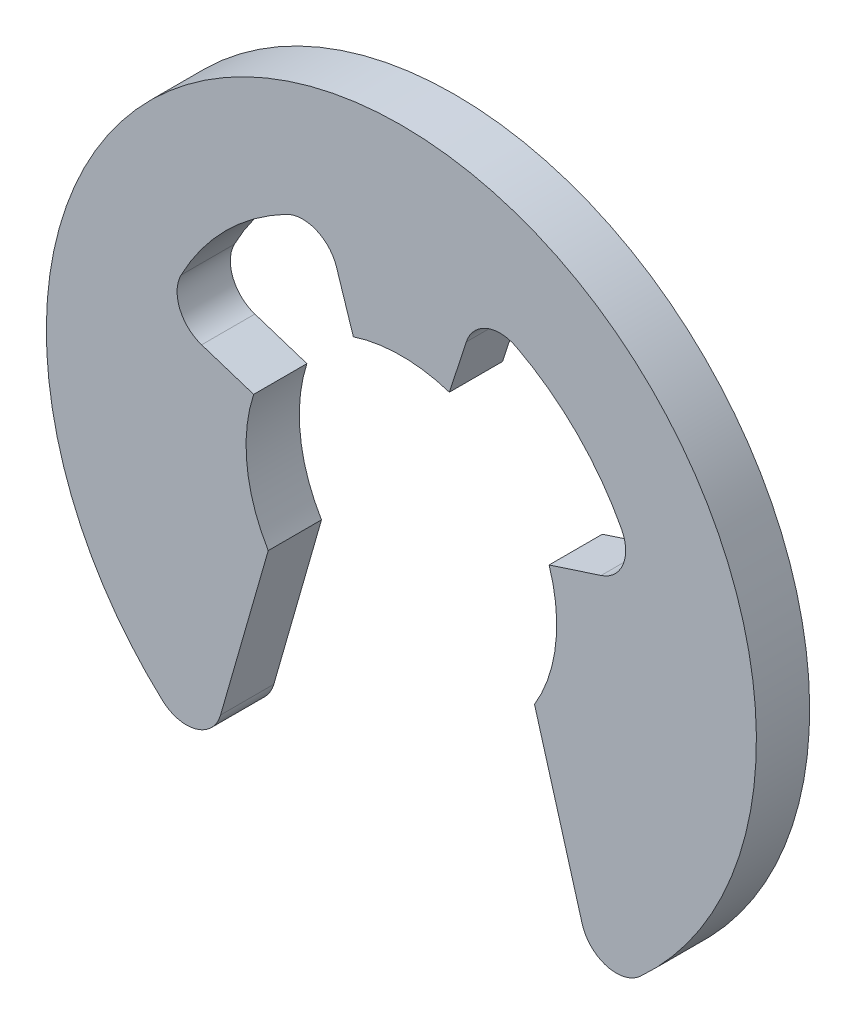
ISO-10303-21;
HEADER;
FILE_DESCRIPTION(('STEP AP214'),'2;1');
FILE_NAME('part.step','',(''),(''),'','','');
FILE_SCHEMA(('AUTOMOTIVE_DESIGN { 1 0 10303 214 1 1 1 1 }'));
ENDSEC;
DATA;
#1=APPLICATION_CONTEXT('core data for automotive mechanical design processes');
#2=APPLICATION_PROTOCOL_DEFINITION('international standard','automotive_design',2000,#1);
#3=PRODUCT_CONTEXT('',#1,'mechanical');
#4=PRODUCT('Part','Part','',(#3));
#5=PRODUCT_RELATED_PRODUCT_CATEGORY('part','',(#4));
#6=PRODUCT_DEFINITION_FORMATION('','',#4);
#7=PRODUCT_DEFINITION_CONTEXT('part definition',#1,'design');
#8=PRODUCT_DEFINITION('design','',#6,#7);
#9=PRODUCT_DEFINITION_SHAPE('','',#8);
#10=(LENGTH_UNIT() NAMED_UNIT(*) SI_UNIT(.MILLI.,.METRE.));
#11=(NAMED_UNIT(*) PLANE_ANGLE_UNIT() SI_UNIT($,.RADIAN.));
#12=(NAMED_UNIT(*) SI_UNIT($,.STERADIAN.) SOLID_ANGLE_UNIT());
#13=UNCERTAINTY_MEASURE_WITH_UNIT(LENGTH_MEASURE(1.E-05),#10,'distance_accuracy_value','');
#14=(GEOMETRIC_REPRESENTATION_CONTEXT(3) GLOBAL_UNCERTAINTY_ASSIGNED_CONTEXT((#13)) GLOBAL_UNIT_ASSIGNED_CONTEXT((#10,
#11,#12)) REPRESENTATION_CONTEXT('',''));
#15=CARTESIAN_POINT('',(0.,0.,0.));
#16=DIRECTION('',(0.,0.,1.));
#17=DIRECTION('',(1.,0.,0.));
#18=AXIS2_PLACEMENT_3D('',#15,#16,#17);
#19=CARTESIAN_POINT('',(2.12700369370558,1.1116902837404,-0.6));
#20=DIRECTION('',(0.,0.,1.));
#21=DIRECTION('',(1.,0.,0.));
#22=AXIS2_PLACEMENT_3D('',#19,#20,#21);
#23=CYLINDRICAL_SURFACE('',#22,0.4);
#24=CARTESIAN_POINT('',(2.12700369370558,1.1116902837404,0.));
#25=DIRECTION('',(0.,0.,-1.));
#26=DIRECTION('',(-1.,0.,0.));
#27=AXIS2_PLACEMENT_3D('',#24,#25,#26);
#28=CIRCLE('',#27,0.4);
#29=CARTESIAN_POINT('',(2.48150430932318,1.29697199769713,0.));
#30=VERTEX_POINT('',#29);
#31=CARTESIAN_POINT('',(2.25061049145556,0.731267677222336,0.));
#32=VERTEX_POINT('',#31);
#33=EDGE_CURVE('E188',#30,#32,#28,.T.);
#34=ORIENTED_EDGE('',*,*,#33,.F.);
#35=DIRECTION('',(0.,0.,1.));
#36=VECTOR('',#35,1.);
#37=CARTESIAN_POINT('',(2.48150430932318,1.29697199769713,-0.6));
#38=LINE('',#37,#36);
#39=CARTESIAN_POINT('',(2.48150430932318,1.29697199769713,-0.6));
#40=VERTEX_POINT('',#39);
#41=EDGE_CURVE('E11',#40,#30,#38,.T.);
#42=ORIENTED_EDGE('',*,*,#41,.F.);
#43=CARTESIAN_POINT('',(2.12700369370558,1.1116902837404,-0.6));
#44=DIRECTION('',(0.,0.,-1.));
#45=DIRECTION('',(-1.,0.,0.));
#46=AXIS2_PLACEMENT_3D('',#43,#44,#45);
#47=CIRCLE('',#46,0.4);
#48=CARTESIAN_POINT('',(2.25061049145556,0.731267677222336,-0.6));
#49=VERTEX_POINT('',#48);
#50=EDGE_CURVE('E238',#40,#49,#47,.T.);
#51=ORIENTED_EDGE('',*,*,#50,.T.);
#52=DIRECTION('',(0.,0.,1.));
#53=VECTOR('',#52,1.);
#54=CARTESIAN_POINT('',(2.25061049145556,0.731267677222336,-0.6));
#55=LINE('',#54,#53);
#56=EDGE_CURVE('E34',#49,#32,#55,.T.);
#57=ORIENTED_EDGE('',*,*,#56,.T.);
#58=EDGE_LOOP('',(#34,#42,#51,#57));
#59=FACE_BOUND('',#58,.T.);
#60=ADVANCED_FACE('F31',(#59),#23,.F.);
#61=CARTESIAN_POINT('',(0.,0.,-0.6));
#62=DIRECTION('',(0.,0.,1.));
#63=DIRECTION('',(1.,0.,0.));
#64=AXIS2_PLACEMENT_3D('',#61,#62,#63);
#65=CYLINDRICAL_SURFACE('',#64,2.8);
#66=CARTESIAN_POINT('',(0.,0.,0.));
#67=DIRECTION('',(0.,0.,-1.));
#68=DIRECTION('',(1.,0.,0.));
#69=AXIS2_PLACEMENT_3D('',#66,#67,#68);
#70=CIRCLE('',#69,2.8);
#71=CARTESIAN_POINT('',(1.29697199769711,2.48150430932319,0.));
#72=VERTEX_POINT('',#71);
#73=EDGE_CURVE('E236',#72,#30,#70,.T.);
#74=ORIENTED_EDGE('',*,*,#73,.F.);
#75=DIRECTION('',(0.,0.,1.));
#76=VECTOR('',#75,1.);
#77=CARTESIAN_POINT('',(1.29697199769711,2.48150430932319,-0.6));
#78=LINE('',#77,#76);
#79=CARTESIAN_POINT('',(1.29697199769711,2.48150430932319,-0.6));
#80=VERTEX_POINT('',#79);
#81=EDGE_CURVE('E40',#80,#72,#78,.T.);
#82=ORIENTED_EDGE('',*,*,#81,.F.);
#83=CARTESIAN_POINT('',(0.,0.,-0.6));
#84=DIRECTION('',(0.,0.,-1.));
#85=DIRECTION('',(1.,0.,0.));
#86=AXIS2_PLACEMENT_3D('',#83,#84,#85);
#87=CIRCLE('',#86,2.8);
#88=EDGE_CURVE('E178',#80,#40,#87,.T.);
#89=ORIENTED_EDGE('',*,*,#88,.T.);
#90=ORIENTED_EDGE('',*,*,#41,.T.);
#91=EDGE_LOOP('',(#74,#82,#89,#90));
#92=FACE_BOUND('',#91,.T.);
#93=ADVANCED_FACE('F270',(#92),#65,.F.);
#94=CARTESIAN_POINT('',(1.11169028374038,2.12700369370559,-0.6));
#95=DIRECTION('',(0.,0.,1.));
#96=DIRECTION('',(1.,0.,0.));
#97=AXIS2_PLACEMENT_3D('',#94,#95,#96);
#98=CYLINDRICAL_SURFACE('',#97,0.4);
#99=CARTESIAN_POINT('',(1.11169028374038,2.12700369370559,0.));
#100=DIRECTION('',(0.,0.,-1.));
#101=DIRECTION('',(-1.,0.,0.));
#102=AXIS2_PLACEMENT_3D('',#99,#100,#101);
#103=CIRCLE('',#102,0.4);
#104=CARTESIAN_POINT('',(0.731267677222318,2.25061049145557,0.));
#105=VERTEX_POINT('',#104);
#106=EDGE_CURVE('E165',#105,#72,#103,.T.);
#107=ORIENTED_EDGE('',*,*,#106,.F.);
#108=DIRECTION('',(0.,0.,1.));
#109=VECTOR('',#108,1.);
#110=CARTESIAN_POINT('',(0.731267677222318,2.25061049145557,-0.6));
#111=LINE('',#110,#109);
#112=CARTESIAN_POINT('',(0.731267677222318,2.25061049145557,-0.6));
#113=VERTEX_POINT('',#112);
#114=EDGE_CURVE('E160',#113,#105,#111,.T.);
#115=ORIENTED_EDGE('',*,*,#114,.F.);
#116=CARTESIAN_POINT('',(1.11169028374038,2.12700369370559,-0.6));
#117=DIRECTION('',(0.,0.,-1.));
#118=DIRECTION('',(-1.,0.,0.));
#119=AXIS2_PLACEMENT_3D('',#116,#117,#118);
#120=CIRCLE('',#119,0.4);
#121=EDGE_CURVE('E163',#113,#80,#120,.T.);
#122=ORIENTED_EDGE('',*,*,#121,.T.);
#123=ORIENTED_EDGE('',*,*,#81,.T.);
#124=EDGE_LOOP('',(#107,#115,#122,#123));
#125=FACE_BOUND('',#124,.T.);
#126=ADVANCED_FACE('F162',(#125),#98,.F.);
#127=CARTESIAN_POINT('',(0.731267677222318,2.25061049145557,-0.6));
#128=DIRECTION('',(0.951056516295156,-0.30901699437494,0.));
#129=DIRECTION('',(0.30901699437494,0.951056516295156,0.));
#130=AXIS2_PLACEMENT_3D('',#127,#128,#129);
#131=PLANE('',#130);
#132=DIRECTION('',(0.30901699437494,0.951056516295156,0.));
#133=VECTOR('',#132,1.);
#134=CARTESIAN_POINT('',(0.731267677222318,2.25061049145557,0.));
#135=LINE('',#134,#133);
#136=CARTESIAN_POINT('',(0.540779740156147,1.66434890351652,0.));
#137=VERTEX_POINT('',#136);
#138=EDGE_CURVE('E233',#137,#105,#135,.T.);
#139=ORIENTED_EDGE('',*,*,#138,.F.);
#140=DIRECTION('',(0.,0.,1.));
#141=VECTOR('',#140,1.);
#142=CARTESIAN_POINT('',(0.540779740156147,1.66434890351652,-0.6));
#143=LINE('',#142,#141);
#144=CARTESIAN_POINT('',(0.540779740156147,1.66434890351652,-0.6));
#145=VERTEX_POINT('',#144);
#146=EDGE_CURVE('E170',#145,#137,#143,.T.);
#147=ORIENTED_EDGE('',*,*,#146,.F.);
#148=DIRECTION('',(0.30901699437494,0.951056516295156,0.));
#149=VECTOR('',#148,1.);
#150=CARTESIAN_POINT('',(0.731267677222318,2.25061049145557,-0.6));
#151=LINE('',#150,#149);
#152=EDGE_CURVE('E176',#145,#113,#151,.T.);
#153=ORIENTED_EDGE('',*,*,#152,.T.);
#154=ORIENTED_EDGE('',*,*,#114,.T.);
#155=EDGE_LOOP('',(#139,#147,#153,#154));
#156=FACE_BOUND('',#155,.T.);
#157=ADVANCED_FACE('F180',(#156),#131,.T.);
#158=CARTESIAN_POINT('',(0.,0.,-0.6));
#159=DIRECTION('',(0.,0.,1.));
#160=DIRECTION('',(1.,0.,0.));
#161=AXIS2_PLACEMENT_3D('',#158,#159,#160);
#162=CYLINDRICAL_SURFACE('',#161,1.75);
#163=CARTESIAN_POINT('',(0.,0.,0.));
#164=DIRECTION('',(0.,0.,-1.));
#165=DIRECTION('',(1.,0.,0.));
#166=AXIS2_PLACEMENT_3D('',#163,#164,#165);
#167=CIRCLE('',#166,1.75);
#168=CARTESIAN_POINT('',(-0.540779740156147,1.66434890351652,0.));
#169=VERTEX_POINT('',#168);
#170=EDGE_CURVE('E230',#169,#137,#167,.T.);
#171=ORIENTED_EDGE('',*,*,#170,.F.);
#172=DIRECTION('',(0.,0.,1.));
#173=VECTOR('',#172,1.);
#174=CARTESIAN_POINT('',(-0.540779740156147,1.66434890351652,-0.6));
#175=LINE('',#174,#173);
#176=CARTESIAN_POINT('',(-0.540779740156147,1.66434890351652,-0.6));
#177=VERTEX_POINT('',#176);
#178=EDGE_CURVE('E242',#177,#169,#175,.T.);
#179=ORIENTED_EDGE('',*,*,#178,.F.);
#180=CARTESIAN_POINT('',(0.,0.,-0.6));
#181=DIRECTION('',(0.,0.,-1.));
#182=DIRECTION('',(1.,0.,0.));
#183=AXIS2_PLACEMENT_3D('',#180,#181,#182);
#184=CIRCLE('',#183,1.75);
#185=EDGE_CURVE('E181',#177,#145,#184,.T.);
#186=ORIENTED_EDGE('',*,*,#185,.T.);
#187=ORIENTED_EDGE('',*,*,#146,.T.);
#188=EDGE_LOOP('',(#171,#179,#186,#187));
#189=FACE_BOUND('',#188,.T.);
#190=ADVANCED_FACE('F283',(#189),#162,.F.);
#191=CARTESIAN_POINT('',(-0.731267677222318,2.25061049145557,-0.6));
#192=DIRECTION('',(-0.951056516295156,-0.309016994374941,0.));
#193=DIRECTION('',(0.309016994374941,-0.951056516295156,0.));
#194=AXIS2_PLACEMENT_3D('',#191,#192,#193);
#195=PLANE('',#194);
#196=DIRECTION('',(0.309016994374941,-0.951056516295156,0.));
#197=VECTOR('',#196,1.);
#198=CARTESIAN_POINT('',(-0.731267677222318,2.25061049145557,0.));
#199=LINE('',#198,#197);
#200=CARTESIAN_POINT('',(-0.731267677222318,2.25061049145557,0.));
#201=VERTEX_POINT('',#200);
#202=EDGE_CURVE('E227',#201,#169,#199,.T.);
#203=ORIENTED_EDGE('',*,*,#202,.F.);
#204=DIRECTION('',(0.,0.,1.));
#205=VECTOR('',#204,1.);
#206=CARTESIAN_POINT('',(-0.731267677222318,2.25061049145557,-0.6));
#207=LINE('',#206,#205);
#208=CARTESIAN_POINT('',(-0.731267677222318,2.25061049145557,-0.6));
#209=VERTEX_POINT('',#208);
#210=EDGE_CURVE('E244',#209,#201,#207,.T.);
#211=ORIENTED_EDGE('',*,*,#210,.F.);
#212=DIRECTION('',(0.309016994374941,-0.951056516295156,0.));
#213=VECTOR('',#212,1.);
#214=CARTESIAN_POINT('',(-0.731267677222318,2.25061049145557,-0.6));
#215=LINE('',#214,#213);
#216=EDGE_CURVE('E183',#209,#177,#215,.T.);
#217=ORIENTED_EDGE('',*,*,#216,.T.);
#218=ORIENTED_EDGE('',*,*,#178,.T.);
#219=EDGE_LOOP('',(#203,#211,#217,#218));
#220=FACE_BOUND('',#219,.T.);
#221=ADVANCED_FACE('F286',(#220),#195,.T.);
#222=CARTESIAN_POINT('',(-1.11169028374038,2.12700369370559,-0.6));
#223=DIRECTION('',(0.,0.,1.));
#224=DIRECTION('',(1.,0.,0.));
#225=AXIS2_PLACEMENT_3D('',#222,#223,#224);
#226=CYLINDRICAL_SURFACE('',#225,0.4);
#227=CARTESIAN_POINT('',(-1.11169028374038,2.12700369370559,0.));
#228=DIRECTION('',(0.,0.,-1.));
#229=DIRECTION('',(1.,0.,0.));
#230=AXIS2_PLACEMENT_3D('',#227,#228,#229);
#231=CIRCLE('',#230,0.4);
#232=CARTESIAN_POINT('',(-1.29697199769711,2.48150430932319,0.));
#233=VERTEX_POINT('',#232);
#234=EDGE_CURVE('E224',#233,#201,#231,.T.);
#235=ORIENTED_EDGE('',*,*,#234,.F.);
#236=DIRECTION('',(0.,0.,1.));
#237=VECTOR('',#236,1.);
#238=CARTESIAN_POINT('',(-1.29697199769711,2.48150430932319,-0.6));
#239=LINE('',#238,#237);
#240=CARTESIAN_POINT('',(-1.29697199769711,2.48150430932319,-0.6));
#241=VERTEX_POINT('',#240);
#242=EDGE_CURVE('E246',#241,#233,#239,.T.);
#243=ORIENTED_EDGE('',*,*,#242,.F.);
#244=CARTESIAN_POINT('',(-1.11169028374038,2.12700369370559,-0.6));
#245=DIRECTION('',(0.,0.,-1.));
#246=DIRECTION('',(1.,0.,0.));
#247=AXIS2_PLACEMENT_3D('',#244,#245,#246);
#248=CIRCLE('',#247,0.4);
#249=EDGE_CURVE('E494',#241,#209,#248,.T.);
#250=ORIENTED_EDGE('',*,*,#249,.T.);
#251=ORIENTED_EDGE('',*,*,#210,.T.);
#252=EDGE_LOOP('',(#235,#243,#250,#251));
#253=FACE_BOUND('',#252,.T.);
#254=ADVANCED_FACE('F290',(#253),#226,.F.);
#255=CARTESIAN_POINT('',(0.,0.,-0.6));
#256=DIRECTION('',(0.,0.,1.));
#257=DIRECTION('',(1.,0.,0.));
#258=AXIS2_PLACEMENT_3D('',#255,#256,#257);
#259=CYLINDRICAL_SURFACE('',#258,2.8);
#260=CARTESIAN_POINT('',(0.,0.,0.));
#261=DIRECTION('',(0.,0.,-1.));
#262=DIRECTION('',(-1.,0.,0.));
#263=AXIS2_PLACEMENT_3D('',#260,#261,#262);
#264=CIRCLE('',#263,2.8);
#265=CARTESIAN_POINT('',(-2.48150430932318,1.29697199769713,0.));
#266=VERTEX_POINT('',#265);
#267=EDGE_CURVE('E221',#266,#233,#264,.T.);
#268=ORIENTED_EDGE('',*,*,#267,.F.);
#269=DIRECTION('',(0.,0.,1.));
#270=VECTOR('',#269,1.);
#271=CARTESIAN_POINT('',(-2.48150430932318,1.29697199769713,-0.6));
#272=LINE('',#271,#270);
#273=CARTESIAN_POINT('',(-2.48150430932318,1.29697199769713,-0.6));
#274=VERTEX_POINT('',#273);
#275=EDGE_CURVE('E248',#274,#266,#272,.T.);
#276=ORIENTED_EDGE('',*,*,#275,.F.);
#277=CARTESIAN_POINT('',(0.,0.,-0.6));
#278=DIRECTION('',(0.,0.,-1.));
#279=DIRECTION('',(-1.,0.,0.));
#280=AXIS2_PLACEMENT_3D('',#277,#278,#279);
#281=CIRCLE('',#280,2.8);
#282=EDGE_CURVE('E498',#274,#241,#281,.T.);
#283=ORIENTED_EDGE('',*,*,#282,.T.);
#284=ORIENTED_EDGE('',*,*,#242,.T.);
#285=EDGE_LOOP('',(#268,#276,#283,#284));
#286=FACE_BOUND('',#285,.T.);
#287=ADVANCED_FACE('F294',(#286),#259,.F.);
#288=CARTESIAN_POINT('',(-2.12700369370558,1.1116902837404,-0.6));
#289=DIRECTION('',(0.,0.,1.));
#290=DIRECTION('',(1.,0.,0.));
#291=AXIS2_PLACEMENT_3D('',#288,#289,#290);
#292=CYLINDRICAL_SURFACE('',#291,0.4);
#293=CARTESIAN_POINT('',(-2.12700369370558,1.1116902837404,0.));
#294=DIRECTION('',(0.,0.,-1.));
#295=DIRECTION('',(1.,0.,0.));
#296=AXIS2_PLACEMENT_3D('',#293,#294,#295);
#297=CIRCLE('',#296,0.4);
#298=CARTESIAN_POINT('',(-2.25061049145556,0.731267677222336,0.));
#299=VERTEX_POINT('',#298);
#300=EDGE_CURVE('E218',#299,#266,#297,.T.);
#301=ORIENTED_EDGE('',*,*,#300,.F.);
#302=DIRECTION('',(0.,0.,1.));
#303=VECTOR('',#302,1.);
#304=CARTESIAN_POINT('',(-2.25061049145556,0.731267677222336,-0.6));
#305=LINE('',#304,#303);
#306=CARTESIAN_POINT('',(-2.25061049145556,0.731267677222336,-0.6));
#307=VERTEX_POINT('',#306);
#308=EDGE_CURVE('E250',#307,#299,#305,.T.);
#309=ORIENTED_EDGE('',*,*,#308,.F.);
#310=CARTESIAN_POINT('',(-2.12700369370558,1.1116902837404,-0.6));
#311=DIRECTION('',(0.,0.,-1.));
#312=DIRECTION('',(1.,0.,0.));
#313=AXIS2_PLACEMENT_3D('',#310,#311,#312);
#314=CIRCLE('',#313,0.4);
#315=EDGE_CURVE('E487',#307,#274,#314,.T.);
#316=ORIENTED_EDGE('',*,*,#315,.T.);
#317=ORIENTED_EDGE('',*,*,#275,.T.);
#318=EDGE_LOOP('',(#301,#309,#316,#317));
#319=FACE_BOUND('',#318,.T.);
#320=ADVANCED_FACE('F298',(#319),#292,.F.);
#321=CARTESIAN_POINT('',(-1.66434890351652,0.54077974015616,-0.6));
#322=DIRECTION('',(0.309016994374949,0.951056516295153,0.));
#323=DIRECTION('',(-0.951056516295153,0.309016994374949,0.));
#324=AXIS2_PLACEMENT_3D('',#321,#322,#323);
#325=PLANE('',#324);
#326=DIRECTION('',(-0.951056516295153,0.309016994374949,0.));
#327=VECTOR('',#326,1.);
#328=CARTESIAN_POINT('',(-1.66434890351652,0.54077974015616,0.));
#329=LINE('',#328,#327);
#330=CARTESIAN_POINT('',(-1.66434890351652,0.54077974015616,0.));
#331=VERTEX_POINT('',#330);
#332=EDGE_CURVE('E215',#331,#299,#329,.T.);
#333=ORIENTED_EDGE('',*,*,#332,.F.);
#334=DIRECTION('',(0.,0.,1.));
#335=VECTOR('',#334,1.);
#336=CARTESIAN_POINT('',(-1.66434890351652,0.54077974015616,-0.6));
#337=LINE('',#336,#335);
#338=CARTESIAN_POINT('',(-1.66434890351652,0.54077974015616,-0.6));
#339=VERTEX_POINT('',#338);
#340=EDGE_CURVE('E252',#339,#331,#337,.T.);
#341=ORIENTED_EDGE('',*,*,#340,.F.);
#342=DIRECTION('',(-0.951056516295153,0.309016994374949,0.));
#343=VECTOR('',#342,1.);
#344=CARTESIAN_POINT('',(-1.66434890351652,0.54077974015616,-0.6));
#345=LINE('',#344,#343);
#346=EDGE_CURVE('E483',#339,#307,#345,.T.);
#347=ORIENTED_EDGE('',*,*,#346,.T.);
#348=ORIENTED_EDGE('',*,*,#308,.T.);
#349=EDGE_LOOP('',(#333,#341,#347,#348));
#350=FACE_BOUND('',#349,.T.);
#351=ADVANCED_FACE('F302',(#350),#325,.T.);
#352=CARTESIAN_POINT('',(0.,0.,-0.6));
#353=DIRECTION('',(0.,0.,1.));
#354=DIRECTION('',(1.,0.,0.));
#355=AXIS2_PLACEMENT_3D('',#352,#353,#354);
#356=CYLINDRICAL_SURFACE('',#355,1.75);
#357=CARTESIAN_POINT('',(0.,0.,0.));
#358=DIRECTION('',(0.,0.,-1.));
#359=DIRECTION('',(-1.,0.,0.));
#360=AXIS2_PLACEMENT_3D('',#357,#358,#359);
#361=CIRCLE('',#360,1.75);
#362=CARTESIAN_POINT('',(-1.5,-0.901387818865998,0.));
#363=VERTEX_POINT('',#362);
#364=EDGE_CURVE('E212',#363,#331,#361,.T.);
#365=ORIENTED_EDGE('',*,*,#364,.F.);
#366=DIRECTION('',(0.,0.,1.));
#367=VECTOR('',#366,1.);
#368=CARTESIAN_POINT('',(-1.5,-0.901387818865998,-0.6));
#369=LINE('',#368,#367);
#370=CARTESIAN_POINT('',(-1.5,-0.901387818865998,-0.6));
#371=VERTEX_POINT('',#370);
#372=EDGE_CURVE('E254',#371,#363,#369,.T.);
#373=ORIENTED_EDGE('',*,*,#372,.F.);
#374=CARTESIAN_POINT('',(0.,0.,-0.6));
#375=DIRECTION('',(0.,0.,-1.));
#376=DIRECTION('',(-1.,0.,0.));
#377=AXIS2_PLACEMENT_3D('',#374,#375,#376);
#378=CIRCLE('',#377,1.75);
#379=EDGE_CURVE('E504',#371,#339,#378,.T.);
#380=ORIENTED_EDGE('',*,*,#379,.T.);
#381=ORIENTED_EDGE('',*,*,#340,.T.);
#382=EDGE_LOOP('',(#365,#373,#380,#381));
#383=FACE_BOUND('',#382,.T.);
#384=ADVANCED_FACE('F306',(#383),#356,.F.);
#385=CARTESIAN_POINT('',(-1.5,-0.901387818865998,-0.6));
#386=DIRECTION('',(0.961261695938318,-0.275637355817001,0.));
#387=DIRECTION('',(0.275637355817001,0.961261695938318,0.));
#388=AXIS2_PLACEMENT_3D('',#385,#386,#387);
#389=PLANE('',#388);
#390=DIRECTION('',(0.275637355817001,0.961261695938319,0.));
#391=VECTOR('',#390,1.);
#392=CARTESIAN_POINT('',(-1.5,-0.901387818865998,0.));
#393=LINE('',#392,#391);
#394=CARTESIAN_POINT('',(-2.0370037611735,-2.77414249197934,0.));
#395=VERTEX_POINT('',#394);
#396=EDGE_CURVE('E209',#395,#363,#393,.T.);
#397=ORIENTED_EDGE('',*,*,#396,.F.);
#398=DIRECTION('',(0.,0.,1.));
#399=VECTOR('',#398,1.);
#400=CARTESIAN_POINT('',(-2.0370037611735,-2.77414249197934,-0.6));
#401=LINE('',#400,#399);
#402=CARTESIAN_POINT('',(-2.0370037611735,-2.77414249197934,-0.6));
#403=VERTEX_POINT('',#402);
#404=EDGE_CURVE('E256',#403,#395,#401,.T.);
#405=ORIENTED_EDGE('',*,*,#404,.F.);
#406=DIRECTION('',(0.275637355817001,0.961261695938319,0.));
#407=VECTOR('',#406,1.);
#408=CARTESIAN_POINT('',(-1.5,-0.901387818865998,-0.6));
#409=LINE('',#408,#407);
#410=EDGE_CURVE('E476',#403,#371,#409,.T.);
#411=ORIENTED_EDGE('',*,*,#410,.T.);
#412=ORIENTED_EDGE('',*,*,#372,.T.);
#413=EDGE_LOOP('',(#397,#405,#411,#412));
#414=FACE_BOUND('',#413,.T.);
#415=ADVANCED_FACE('F310',(#414),#389,.T.);
#416=CARTESIAN_POINT('',(-2.42150843954882,-2.66388754965254,-0.6));
#417=DIRECTION('',(0.,0.,1.));
#418=DIRECTION('',(1.,0.,0.));
#419=AXIS2_PLACEMENT_3D('',#416,#417,#418);
#420=CYLINDRICAL_SURFACE('',#419,0.399999999999999);
#421=CARTESIAN_POINT('',(-2.42150843954882,-2.66388754965254,0.));
#422=DIRECTION('',(0.,0.,1.));
#423=DIRECTION('',(-1.,0.,0.));
#424=AXIS2_PLACEMENT_3D('',#421,#422,#423);
#425=CIRCLE('',#424,0.399999999999999);
#426=CARTESIAN_POINT('',(-2.69056493283203,-2.95987505516949,0.));
#427=VERTEX_POINT('',#426);
#428=EDGE_CURVE('E206',#427,#395,#425,.T.);
#429=ORIENTED_EDGE('',*,*,#428,.F.);
#430=DIRECTION('',(0.,0.,1.));
#431=VECTOR('',#430,1.);
#432=CARTESIAN_POINT('',(-2.69056493283203,-2.95987505516949,-0.6));
#433=LINE('',#432,#431);
#434=CARTESIAN_POINT('',(-2.69056493283203,-2.95987505516949,-0.6));
#435=VERTEX_POINT('',#434);
#436=EDGE_CURVE('E258',#435,#427,#433,.T.);
#437=ORIENTED_EDGE('',*,*,#436,.F.);
#438=CARTESIAN_POINT('',(-2.42150843954882,-2.66388754965254,-0.6));
#439=DIRECTION('',(0.,0.,1.));
#440=DIRECTION('',(-1.,0.,0.));
#441=AXIS2_PLACEMENT_3D('',#438,#439,#440);
#442=CIRCLE('',#441,0.399999999999999);
#443=EDGE_CURVE('E472',#435,#403,#442,.T.);
#444=ORIENTED_EDGE('',*,*,#443,.T.);
#445=ORIENTED_EDGE('',*,*,#404,.T.);
#446=EDGE_LOOP('',(#429,#437,#444,#445));
#447=FACE_BOUND('',#446,.T.);
#448=ADVANCED_FACE('F314',(#447),#420,.T.);
#449=CARTESIAN_POINT('',(0.,0.,-0.6));
#450=DIRECTION('',(0.,0.,1.));
#451=DIRECTION('',(1.,0.,0.));
#452=AXIS2_PLACEMENT_3D('',#449,#450,#451);
#453=CYLINDRICAL_SURFACE('',#452,4.);
#454=CARTESIAN_POINT('',(0.,0.,0.));
#455=DIRECTION('',(0.,0.,1.));
#456=DIRECTION('',(1.,0.,0.));
#457=AXIS2_PLACEMENT_3D('',#454,#455,#456);
#458=CIRCLE('',#457,4.);
#459=CARTESIAN_POINT('',(2.69056493283203,-2.95987505516949,0.));
#460=VERTEX_POINT('',#459);
#461=EDGE_CURVE('E203',#460,#427,#458,.T.);
#462=ORIENTED_EDGE('',*,*,#461,.F.);
#463=DIRECTION('',(0.,0.,1.));
#464=VECTOR('',#463,1.);
#465=CARTESIAN_POINT('',(2.69056493283203,-2.95987505516949,-0.6));
#466=LINE('',#465,#464);
#467=CARTESIAN_POINT('',(2.69056493283203,-2.95987505516949,-0.6));
#468=VERTEX_POINT('',#467);
#469=EDGE_CURVE('E260',#468,#460,#466,.T.);
#470=ORIENTED_EDGE('',*,*,#469,.F.);
#471=CARTESIAN_POINT('',(0.,0.,-0.6));
#472=DIRECTION('',(0.,0.,1.));
#473=DIRECTION('',(1.,0.,0.));
#474=AXIS2_PLACEMENT_3D('',#471,#472,#473);
#475=CIRCLE('',#474,4.);
#476=EDGE_CURVE('E508',#468,#435,#475,.T.);
#477=ORIENTED_EDGE('',*,*,#476,.T.);
#478=ORIENTED_EDGE('',*,*,#436,.T.);
#479=EDGE_LOOP('',(#462,#470,#477,#478));
#480=FACE_BOUND('',#479,.T.);
#481=ADVANCED_FACE('F318',(#480),#453,.T.);
#482=CARTESIAN_POINT('',(2.42150843954883,-2.66388754965254,-0.6));
#483=DIRECTION('',(0.,0.,1.));
#484=DIRECTION('',(1.,0.,0.));
#485=AXIS2_PLACEMENT_3D('',#482,#483,#484);
#486=CYLINDRICAL_SURFACE('',#485,0.399999999999999);
#487=CARTESIAN_POINT('',(2.42150843954883,-2.66388754965254,0.));
#488=DIRECTION('',(0.,0.,1.));
#489=DIRECTION('',(1.,0.,0.));
#490=AXIS2_PLACEMENT_3D('',#487,#488,#489);
#491=CIRCLE('',#490,0.399999999999999);
#492=CARTESIAN_POINT('',(2.0370037611735,-2.77414249197934,0.));
#493=VERTEX_POINT('',#492);
#494=EDGE_CURVE('E200',#493,#460,#491,.T.);
#495=ORIENTED_EDGE('',*,*,#494,.F.);
#496=DIRECTION('',(0.,0.,1.));
#497=VECTOR('',#496,1.);
#498=CARTESIAN_POINT('',(2.0370037611735,-2.77414249197934,-0.6));
#499=LINE('',#498,#497);
#500=CARTESIAN_POINT('',(2.0370037611735,-2.77414249197934,-0.6));
#501=VERTEX_POINT('',#500);
#502=EDGE_CURVE('E262',#501,#493,#499,.T.);
#503=ORIENTED_EDGE('',*,*,#502,.F.);
#504=CARTESIAN_POINT('',(2.42150843954883,-2.66388754965254,-0.6));
#505=DIRECTION('',(0.,0.,1.));
#506=DIRECTION('',(1.,0.,0.));
#507=AXIS2_PLACEMENT_3D('',#504,#505,#506);
#508=CIRCLE('',#507,0.399999999999999);
#509=EDGE_CURVE('E465',#501,#468,#508,.T.);
#510=ORIENTED_EDGE('',*,*,#509,.T.);
#511=ORIENTED_EDGE('',*,*,#469,.T.);
#512=EDGE_LOOP('',(#495,#503,#510,#511));
#513=FACE_BOUND('',#512,.T.);
#514=ADVANCED_FACE('F322',(#513),#486,.T.);
#515=CARTESIAN_POINT('',(1.5,-0.901387818865998,-0.6));
#516=DIRECTION('',(-0.961261695938318,-0.275637355817001,0.));
#517=DIRECTION('',(0.275637355817001,-0.961261695938318,0.));
#518=AXIS2_PLACEMENT_3D('',#515,#516,#517);
#519=PLANE('',#518);
#520=DIRECTION('',(0.275637355817001,-0.961261695938319,0.));
#521=VECTOR('',#520,1.);
#522=CARTESIAN_POINT('',(1.5,-0.901387818865998,0.));
#523=LINE('',#522,#521);
#524=CARTESIAN_POINT('',(1.5,-0.901387818865998,0.));
#525=VERTEX_POINT('',#524);
#526=EDGE_CURVE('E197',#525,#493,#523,.T.);
#527=ORIENTED_EDGE('',*,*,#526,.F.);
#528=DIRECTION('',(0.,0.,1.));
#529=VECTOR('',#528,1.);
#530=CARTESIAN_POINT('',(1.5,-0.901387818865998,-0.6));
#531=LINE('',#530,#529);
#532=CARTESIAN_POINT('',(1.5,-0.901387818865998,-0.6));
#533=VERTEX_POINT('',#532);
#534=EDGE_CURVE('E264',#533,#525,#531,.T.);
#535=ORIENTED_EDGE('',*,*,#534,.F.);
#536=DIRECTION('',(0.275637355817001,-0.961261695938319,0.));
#537=VECTOR('',#536,1.);
#538=CARTESIAN_POINT('',(1.5,-0.901387818865998,-0.6));
#539=LINE('',#538,#537);
#540=EDGE_CURVE('E461',#533,#501,#539,.T.);
#541=ORIENTED_EDGE('',*,*,#540,.T.);
#542=ORIENTED_EDGE('',*,*,#502,.T.);
#543=EDGE_LOOP('',(#527,#535,#541,#542));
#544=FACE_BOUND('',#543,.T.);
#545=ADVANCED_FACE('F326',(#544),#519,.T.);
#546=CARTESIAN_POINT('',(0.,0.,-0.6));
#547=DIRECTION('',(0.,0.,1.));
#548=DIRECTION('',(1.,0.,0.));
#549=AXIS2_PLACEMENT_3D('',#546,#547,#548);
#550=CYLINDRICAL_SURFACE('',#549,1.75);
#551=CARTESIAN_POINT('',(0.,0.,0.));
#552=DIRECTION('',(0.,0.,-1.));
#553=DIRECTION('',(1.,0.,0.));
#554=AXIS2_PLACEMENT_3D('',#551,#552,#553);
#555=CIRCLE('',#554,1.75);
#556=CARTESIAN_POINT('',(1.66434890351652,0.54077974015616,0.));
#557=VERTEX_POINT('',#556);
#558=EDGE_CURVE('E194',#557,#525,#555,.T.);
#559=ORIENTED_EDGE('',*,*,#558,.F.);
#560=DIRECTION('',(0.,0.,1.));
#561=VECTOR('',#560,1.);
#562=CARTESIAN_POINT('',(1.66434890351652,0.54077974015616,-0.6));
#563=LINE('',#562,#561);
#564=CARTESIAN_POINT('',(1.66434890351652,0.54077974015616,-0.6));
#565=VERTEX_POINT('',#564);
#566=EDGE_CURVE('E265',#565,#557,#563,.T.);
#567=ORIENTED_EDGE('',*,*,#566,.F.);
#568=CARTESIAN_POINT('',(0.,0.,-0.6));
#569=DIRECTION('',(0.,0.,-1.));
#570=DIRECTION('',(1.,0.,0.));
#571=AXIS2_PLACEMENT_3D('',#568,#569,#570);
#572=CIRCLE('',#571,1.75);
#573=EDGE_CURVE('E512',#565,#533,#572,.T.);
#574=ORIENTED_EDGE('',*,*,#573,.T.);
#575=ORIENTED_EDGE('',*,*,#534,.T.);
#576=EDGE_LOOP('',(#559,#567,#574,#575));
#577=FACE_BOUND('',#576,.T.);
#578=ADVANCED_FACE('F330',(#577),#550,.F.);
#579=CARTESIAN_POINT('',(1.66434890351652,0.54077974015616,-0.6));
#580=DIRECTION('',(-0.309016994374949,0.951056516295153,0.));
#581=DIRECTION('',(-0.951056516295153,-0.309016994374949,0.));
#582=AXIS2_PLACEMENT_3D('',#579,#580,#581);
#583=PLANE('',#582);
#584=DIRECTION('',(-0.951056516295153,-0.309016994374949,0.));
#585=VECTOR('',#584,1.);
#586=CARTESIAN_POINT('',(1.66434890351652,0.54077974015616,0.));
#587=LINE('',#586,#585);
#588=EDGE_CURVE('E191',#32,#557,#587,.T.);
#589=ORIENTED_EDGE('',*,*,#588,.F.);
#590=ORIENTED_EDGE('',*,*,#56,.F.);
#591=DIRECTION('',(-0.951056516295153,-0.309016994374949,0.));
#592=VECTOR('',#591,1.);
#593=CARTESIAN_POINT('',(1.66434890351652,0.54077974015616,-0.6));
#594=LINE('',#593,#592);
#595=EDGE_CURVE('E514',#49,#565,#594,.T.);
#596=ORIENTED_EDGE('',*,*,#595,.T.);
#597=ORIENTED_EDGE('',*,*,#566,.T.);
#598=EDGE_LOOP('',(#589,#590,#596,#597));
#599=FACE_BOUND('',#598,.T.);
#600=ADVANCED_FACE('F267',(#599),#583,.T.);
#601=CARTESIAN_POINT('',(2.12700369370558,1.1116902837404,-0.6));
#602=DIRECTION('',(0.,0.,-1.));
#603=DIRECTION('',(-1.,0.,0.));
#604=AXIS2_PLACEMENT_3D('',#601,#602,#603);
#605=PLANE('',#604);
#606=ORIENTED_EDGE('',*,*,#50,.F.);
#607=ORIENTED_EDGE('',*,*,#88,.F.);
#608=ORIENTED_EDGE('',*,*,#121,.F.);
#609=ORIENTED_EDGE('',*,*,#152,.F.);
#610=ORIENTED_EDGE('',*,*,#185,.F.);
#611=ORIENTED_EDGE('',*,*,#216,.F.);
#612=ORIENTED_EDGE('',*,*,#249,.F.);
#613=ORIENTED_EDGE('',*,*,#282,.F.);
#614=ORIENTED_EDGE('',*,*,#315,.F.);
#615=ORIENTED_EDGE('',*,*,#346,.F.);
#616=ORIENTED_EDGE('',*,*,#379,.F.);
#617=ORIENTED_EDGE('',*,*,#410,.F.);
#618=ORIENTED_EDGE('',*,*,#443,.F.);
#619=ORIENTED_EDGE('',*,*,#476,.F.);
#620=ORIENTED_EDGE('',*,*,#509,.F.);
#621=ORIENTED_EDGE('',*,*,#540,.F.);
#622=ORIENTED_EDGE('',*,*,#573,.F.);
#623=ORIENTED_EDGE('',*,*,#595,.F.);
#624=EDGE_LOOP('',(#606,#607,#608,#609,#610,#611,#612,#613,#614,#615,#616,#617,#618,#619,#620,
#621,#622,#623));
#625=FACE_BOUND('',#624,.T.);
#626=ADVANCED_FACE('F174',(#625),#605,.T.);
#627=CARTESIAN_POINT('',(2.12700369370558,1.1116902837404,0.));
#628=DIRECTION('',(0.,0.,-1.));
#629=DIRECTION('',(-1.,0.,0.));
#630=AXIS2_PLACEMENT_3D('',#627,#628,#629);
#631=PLANE('',#630);
#632=ORIENTED_EDGE('',*,*,#33,.T.);
#633=ORIENTED_EDGE('',*,*,#588,.T.);
#634=ORIENTED_EDGE('',*,*,#558,.T.);
#635=ORIENTED_EDGE('',*,*,#526,.T.);
#636=ORIENTED_EDGE('',*,*,#494,.T.);
#637=ORIENTED_EDGE('',*,*,#461,.T.);
#638=ORIENTED_EDGE('',*,*,#428,.T.);
#639=ORIENTED_EDGE('',*,*,#396,.T.);
#640=ORIENTED_EDGE('',*,*,#364,.T.);
#641=ORIENTED_EDGE('',*,*,#332,.T.);
#642=ORIENTED_EDGE('',*,*,#300,.T.);
#643=ORIENTED_EDGE('',*,*,#267,.T.);
#644=ORIENTED_EDGE('',*,*,#234,.T.);
#645=ORIENTED_EDGE('',*,*,#202,.T.);
#646=ORIENTED_EDGE('',*,*,#170,.T.);
#647=ORIENTED_EDGE('',*,*,#138,.T.);
#648=ORIENTED_EDGE('',*,*,#106,.T.);
#649=ORIENTED_EDGE('',*,*,#73,.T.);
#650=EDGE_LOOP('',(#632,#633,#634,#635,#636,#637,#638,#639,#640,#641,#642,#643,#644,#645,#646,
#647,#648,#649));
#651=FACE_BOUND('',#650,.T.);
#652=ADVANCED_FACE('F269',(#651),#631,.F.);
#653=CLOSED_SHELL('',(#60,#93,#126,#157,#190,#221,#254,#287,#320,#351,#384,#415,#448,#481,#514,
#545,#578,#600,#626,#652));
#654=MANIFOLD_SOLID_BREP('B2',#653);
#655=ADVANCED_BREP_SHAPE_REPRESENTATION('',(#18,#654),#14);
#656=SHAPE_DEFINITION_REPRESENTATION(#9,#655);
ENDSEC;
END-ISO-10303-21;
